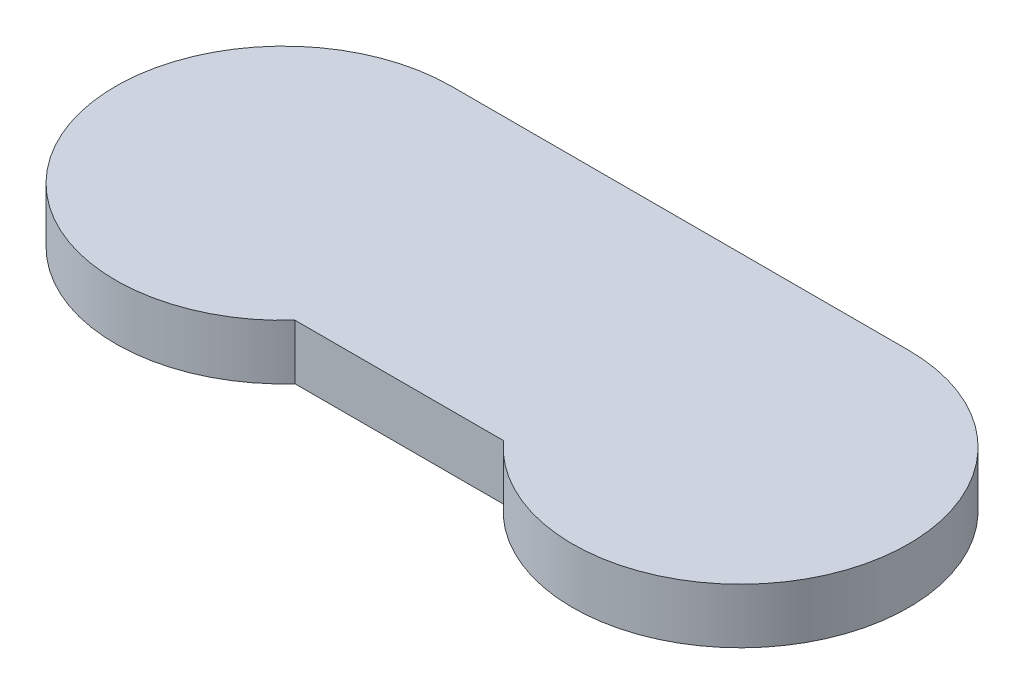
ISO-10303-21;
HEADER;
FILE_DESCRIPTION(('STEP AP214'),'2;1');
FILE_NAME('part.step','',(''),(''),'','','');
FILE_SCHEMA(('AUTOMOTIVE_DESIGN { 1 0 10303 214 1 1 1 1 }'));
ENDSEC;
DATA;
#1=APPLICATION_CONTEXT('core data for automotive mechanical design processes');
#2=APPLICATION_PROTOCOL_DEFINITION('international standard','automotive_design',2000,#1);
#3=PRODUCT_CONTEXT('',#1,'mechanical');
#4=PRODUCT('Part','Part','',(#3));
#5=PRODUCT_RELATED_PRODUCT_CATEGORY('part','',(#4));
#6=PRODUCT_DEFINITION_FORMATION('','',#4);
#7=PRODUCT_DEFINITION_CONTEXT('part definition',#1,'design');
#8=PRODUCT_DEFINITION('design','',#6,#7);
#9=PRODUCT_DEFINITION_SHAPE('','',#8);
#10=(LENGTH_UNIT() NAMED_UNIT(*) SI_UNIT(.MILLI.,.METRE.));
#11=(NAMED_UNIT(*) PLANE_ANGLE_UNIT() SI_UNIT($,.RADIAN.));
#12=(NAMED_UNIT(*) SI_UNIT($,.STERADIAN.) SOLID_ANGLE_UNIT());
#13=UNCERTAINTY_MEASURE_WITH_UNIT(LENGTH_MEASURE(1.E-05),#10,'distance_accuracy_value','');
#14=(GEOMETRIC_REPRESENTATION_CONTEXT(3) GLOBAL_UNCERTAINTY_ASSIGNED_CONTEXT((#13)) GLOBAL_UNIT_ASSIGNED_CONTEXT((#10,
#11,#12)) REPRESENTATION_CONTEXT('',''));
#15=CARTESIAN_POINT('',(0.,0.,0.));
#16=DIRECTION('',(0.,0.,1.));
#17=DIRECTION('',(1.,0.,0.));
#18=AXIS2_PLACEMENT_3D('',#15,#16,#17);
#19=CARTESIAN_POINT('',(-41.5000000000001,0.,0.));
#20=DIRECTION('',(0.,1.,0.));
#21=DIRECTION('',(0.,0.,1.));
#22=AXIS2_PLACEMENT_3D('',#19,#20,#21);
#23=PLANE('',#22);
#24=CARTESIAN_POINT('',(-41.5000000000001,0.,0.));
#25=DIRECTION('',(0.,1.,0.));
#26=DIRECTION('',(0.,0.,1.));
#27=AXIS2_PLACEMENT_3D('',#24,#25,#26);
#28=CIRCLE('',#27,30.5);
#29=CARTESIAN_POINT('',(-41.5000000000001,0.,-30.5));
#30=VERTEX_POINT('',#29);
#31=CARTESIAN_POINT('',(-18.9168204187277,0.,20.5));
#32=VERTEX_POINT('',#31);
#33=EDGE_CURVE('E126',#30,#32,#28,.T.);
#34=ORIENTED_EDGE('',*,*,#33,.F.);
#35=DIRECTION('',(-1.,0.,0.));
#36=VECTOR('',#35,1.);
#37=CARTESIAN_POINT('',(41.4999999999999,0.,-30.5));
#38=LINE('',#37,#36);
#39=CARTESIAN_POINT('',(41.4999999999999,0.,-30.5));
#40=VERTEX_POINT('',#39);
#41=EDGE_CURVE('E77',#40,#30,#38,.T.);
#42=ORIENTED_EDGE('',*,*,#41,.F.);
#43=CARTESIAN_POINT('',(41.4999999999999,0.,0.));
#44=DIRECTION('',(0.,1.,0.));
#45=DIRECTION('',(0.,0.,1.));
#46=AXIS2_PLACEMENT_3D('',#43,#44,#45);
#47=CIRCLE('',#46,30.5);
#48=CARTESIAN_POINT('',(18.9168204187274,0.,20.5));
#49=VERTEX_POINT('',#48);
#50=EDGE_CURVE('E144',#49,#40,#47,.T.);
#51=ORIENTED_EDGE('',*,*,#50,.F.);
#52=DIRECTION('',(1.,0.,0.));
#53=VECTOR('',#52,1.);
#54=CARTESIAN_POINT('',(-18.9168204187277,0.,20.5));
#55=LINE('',#54,#53);
#56=EDGE_CURVE('E130',#32,#49,#55,.T.);
#57=ORIENTED_EDGE('',*,*,#56,.F.);
#58=EDGE_LOOP('',(#34,#42,#51,#57));
#59=FACE_BOUND('',#58,.T.);
#60=CARTESIAN_POINT('',(41.4999999999999,0.,0.));
#61=DIRECTION('',(0.,1.,0.));
#62=DIRECTION('',(0.,0.,1.));
#63=AXIS2_PLACEMENT_3D('',#60,#61,#62);
#64=CIRCLE('',#63,25.5);
#65=CARTESIAN_POINT('',(21.2515432686833,0.,15.5));
#66=VERTEX_POINT('',#65);
#67=CARTESIAN_POINT('',(41.4999999999999,0.,-25.5));
#68=VERTEX_POINT('',#67);
#69=EDGE_CURVE('E47',#66,#68,#64,.T.);
#70=ORIENTED_EDGE('',*,*,#69,.T.);
#71=DIRECTION('',(-1.,0.,0.));
#72=VECTOR('',#71,1.);
#73=CARTESIAN_POINT('',(41.4999999999999,0.,-25.5));
#74=LINE('',#73,#72);
#75=CARTESIAN_POINT('',(-41.5000000000001,0.,-25.5));
#76=VERTEX_POINT('',#75);
#77=EDGE_CURVE('E125',#68,#76,#74,.T.);
#78=ORIENTED_EDGE('',*,*,#77,.T.);
#79=CARTESIAN_POINT('',(-41.5000000000001,0.,0.));
#80=DIRECTION('',(0.,1.,0.));
#81=DIRECTION('',(0.,0.,1.));
#82=AXIS2_PLACEMENT_3D('',#79,#80,#81);
#83=CIRCLE('',#82,25.5);
#84=CARTESIAN_POINT('',(-21.2515432686835,0.,15.5));
#85=VERTEX_POINT('',#84);
#86=EDGE_CURVE('E258',#76,#85,#83,.T.);
#87=ORIENTED_EDGE('',*,*,#86,.T.);
#88=DIRECTION('',(1.,0.,0.));
#89=VECTOR('',#88,1.);
#90=CARTESIAN_POINT('',(-21.2515432686835,0.,15.5));
#91=LINE('',#90,#89);
#92=EDGE_CURVE('E121',#85,#66,#91,.T.);
#93=ORIENTED_EDGE('',*,*,#92,.T.);
#94=EDGE_LOOP('',(#70,#78,#87,#93));
#95=FACE_BOUND('',#94,.T.);
#96=ADVANCED_FACE('F32',(#59,#95),#23,.F.);
#97=CARTESIAN_POINT('',(-41.5000000000001,10.,0.));
#98=DIRECTION('',(0.,-1.,0.));
#99=DIRECTION('',(0.,0.,-1.));
#100=AXIS2_PLACEMENT_3D('',#97,#98,#99);
#101=CYLINDRICAL_SURFACE('',#100,30.5);
#102=ORIENTED_EDGE('',*,*,#33,.T.);
#103=DIRECTION('',(0.,-1.,0.));
#104=VECTOR('',#103,1.);
#105=CARTESIAN_POINT('',(-18.9168204187277,10.,20.5));
#106=LINE('',#105,#104);
#107=CARTESIAN_POINT('',(-18.9168204187277,10.,20.5));
#108=VERTEX_POINT('',#107);
#109=EDGE_CURVE('E11',#108,#32,#106,.T.);
#110=ORIENTED_EDGE('',*,*,#109,.F.);
#111=CARTESIAN_POINT('',(-41.5000000000001,10.,0.));
#112=DIRECTION('',(0.,1.,0.));
#113=DIRECTION('',(0.,0.,1.));
#114=AXIS2_PLACEMENT_3D('',#111,#112,#113);
#115=CIRCLE('',#114,30.5);
#116=CARTESIAN_POINT('',(-41.5000000000001,10.,-30.5));
#117=VERTEX_POINT('',#116);
#118=EDGE_CURVE('E136',#117,#108,#115,.T.);
#119=ORIENTED_EDGE('',*,*,#118,.F.);
#120=DIRECTION('',(0.,-1.,0.));
#121=VECTOR('',#120,1.);
#122=CARTESIAN_POINT('',(-41.5000000000001,10.,-30.5));
#123=LINE('',#122,#121);
#124=EDGE_CURVE('E141',#117,#30,#123,.T.);
#125=ORIENTED_EDGE('',*,*,#124,.T.);
#126=EDGE_LOOP('',(#102,#110,#119,#125));
#127=FACE_BOUND('',#126,.T.);
#128=ADVANCED_FACE('F34',(#127),#101,.T.);
#129=CARTESIAN_POINT('',(-18.9168204187277,10.,20.5));
#130=DIRECTION('',(0.,0.,-1.));
#131=DIRECTION('',(-1.,0.,0.));
#132=AXIS2_PLACEMENT_3D('',#129,#130,#131);
#133=PLANE('',#132);
#134=ORIENTED_EDGE('',*,*,#56,.T.);
#135=DIRECTION('',(0.,-1.,0.));
#136=VECTOR('',#135,1.);
#137=CARTESIAN_POINT('',(18.9168204187274,10.,20.5));
#138=LINE('',#137,#136);
#139=CARTESIAN_POINT('',(18.9168204187274,10.,20.5));
#140=VERTEX_POINT('',#139);
#141=EDGE_CURVE('E40',#140,#49,#138,.T.);
#142=ORIENTED_EDGE('',*,*,#141,.F.);
#143=DIRECTION('',(1.,0.,0.));
#144=VECTOR('',#143,1.);
#145=CARTESIAN_POINT('',(-18.9168204187277,10.,20.5));
#146=LINE('',#145,#144);
#147=EDGE_CURVE('E84',#108,#140,#146,.T.);
#148=ORIENTED_EDGE('',*,*,#147,.F.);
#149=ORIENTED_EDGE('',*,*,#109,.T.);
#150=EDGE_LOOP('',(#134,#142,#148,#149));
#151=FACE_BOUND('',#150,.T.);
#152=ADVANCED_FACE('F170',(#151),#133,.F.);
#153=CARTESIAN_POINT('',(41.4999999999999,10.,0.));
#154=DIRECTION('',(0.,-1.,0.));
#155=DIRECTION('',(0.,0.,-1.));
#156=AXIS2_PLACEMENT_3D('',#153,#154,#155);
#157=CYLINDRICAL_SURFACE('',#156,30.5);
#158=ORIENTED_EDGE('',*,*,#50,.T.);
#159=DIRECTION('',(0.,-1.,0.));
#160=VECTOR('',#159,1.);
#161=CARTESIAN_POINT('',(41.4999999999999,10.,-30.5));
#162=LINE('',#161,#160);
#163=CARTESIAN_POINT('',(41.4999999999999,10.,-30.5));
#164=VERTEX_POINT('',#163);
#165=EDGE_CURVE('E148',#164,#40,#162,.T.);
#166=ORIENTED_EDGE('',*,*,#165,.F.);
#167=CARTESIAN_POINT('',(41.4999999999999,10.,0.));
#168=DIRECTION('',(0.,1.,0.));
#169=DIRECTION('',(0.,0.,1.));
#170=AXIS2_PLACEMENT_3D('',#167,#168,#169);
#171=CIRCLE('',#170,30.5);
#172=EDGE_CURVE('E139',#140,#164,#171,.T.);
#173=ORIENTED_EDGE('',*,*,#172,.F.);
#174=ORIENTED_EDGE('',*,*,#141,.T.);
#175=EDGE_LOOP('',(#158,#166,#173,#174));
#176=FACE_BOUND('',#175,.T.);
#177=ADVANCED_FACE('F153',(#176),#157,.T.);
#178=CARTESIAN_POINT('',(41.4999999999999,10.,-30.5));
#179=DIRECTION('',(0.,0.,1.));
#180=DIRECTION('',(1.,0.,0.));
#181=AXIS2_PLACEMENT_3D('',#178,#179,#180);
#182=PLANE('',#181);
#183=ORIENTED_EDGE('',*,*,#41,.T.);
#184=ORIENTED_EDGE('',*,*,#124,.F.);
#185=DIRECTION('',(-1.,0.,0.));
#186=VECTOR('',#185,1.);
#187=CARTESIAN_POINT('',(41.4999999999999,10.,-30.5));
#188=LINE('',#187,#186);
#189=EDGE_CURVE('E56',#164,#117,#188,.T.);
#190=ORIENTED_EDGE('',*,*,#189,.F.);
#191=ORIENTED_EDGE('',*,*,#165,.T.);
#192=EDGE_LOOP('',(#183,#184,#190,#191));
#193=FACE_BOUND('',#192,.T.);
#194=ADVANCED_FACE('F161',(#193),#182,.F.);
#195=CARTESIAN_POINT('',(-41.5000000000001,10.,0.));
#196=DIRECTION('',(0.,1.,0.));
#197=DIRECTION('',(0.,0.,1.));
#198=AXIS2_PLACEMENT_3D('',#195,#196,#197);
#199=PLANE('',#198);
#200=ORIENTED_EDGE('',*,*,#118,.T.);
#201=ORIENTED_EDGE('',*,*,#147,.T.);
#202=ORIENTED_EDGE('',*,*,#172,.T.);
#203=ORIENTED_EDGE('',*,*,#189,.T.);
#204=EDGE_LOOP('',(#200,#201,#202,#203));
#205=FACE_BOUND('',#204,.T.);
#206=ADVANCED_FACE('F163',(#205),#199,.T.);
#207=CARTESIAN_POINT('',(41.4999999999999,5.,0.));
#208=DIRECTION('',(0.,-1.,0.));
#209=DIRECTION('',(0.,0.,-1.));
#210=AXIS2_PLACEMENT_3D('',#207,#208,#209);
#211=CYLINDRICAL_SURFACE('',#210,25.5);
#212=ORIENTED_EDGE('',*,*,#69,.F.);
#213=DIRECTION('',(0.,-1.,0.));
#214=VECTOR('',#213,1.);
#215=CARTESIAN_POINT('',(21.2515432686833,5.,15.5));
#216=LINE('',#215,#214);
#217=CARTESIAN_POINT('',(21.2515432686833,5.,15.5));
#218=VERTEX_POINT('',#217);
#219=EDGE_CURVE('E120',#218,#66,#216,.T.);
#220=ORIENTED_EDGE('',*,*,#219,.F.);
#221=CARTESIAN_POINT('',(41.4999999999999,5.,0.));
#222=DIRECTION('',(0.,1.,0.));
#223=DIRECTION('',(0.,0.,1.));
#224=AXIS2_PLACEMENT_3D('',#221,#222,#223);
#225=CIRCLE('',#224,25.5);
#226=CARTESIAN_POINT('',(41.4999999999999,5.,-25.5));
#227=VERTEX_POINT('',#226);
#228=EDGE_CURVE('E112',#218,#227,#225,.T.);
#229=ORIENTED_EDGE('',*,*,#228,.T.);
#230=DIRECTION('',(0.,-1.,0.));
#231=VECTOR('',#230,1.);
#232=CARTESIAN_POINT('',(41.4999999999999,5.,-25.5));
#233=LINE('',#232,#231);
#234=EDGE_CURVE('E119',#227,#68,#233,.T.);
#235=ORIENTED_EDGE('',*,*,#234,.T.);
#236=EDGE_LOOP('',(#212,#220,#229,#235));
#237=FACE_BOUND('',#236,.T.);
#238=ADVANCED_FACE('F118',(#237),#211,.F.);
#239=CARTESIAN_POINT('',(41.4999999999999,5.,-25.5));
#240=DIRECTION('',(0.,0.,1.));
#241=DIRECTION('',(1.,0.,0.));
#242=AXIS2_PLACEMENT_3D('',#239,#240,#241);
#243=PLANE('',#242);
#244=ORIENTED_EDGE('',*,*,#77,.F.);
#245=ORIENTED_EDGE('',*,*,#234,.F.);
#246=DIRECTION('',(-1.,0.,0.));
#247=VECTOR('',#246,1.);
#248=CARTESIAN_POINT('',(41.4999999999999,5.,-25.5));
#249=LINE('',#248,#247);
#250=CARTESIAN_POINT('',(-41.5000000000001,5.,-25.5));
#251=VERTEX_POINT('',#250);
#252=EDGE_CURVE('E108',#227,#251,#249,.T.);
#253=ORIENTED_EDGE('',*,*,#252,.T.);
#254=DIRECTION('',(0.,-1.,0.));
#255=VECTOR('',#254,1.);
#256=CARTESIAN_POINT('',(-41.5000000000001,5.,-25.5));
#257=LINE('',#256,#255);
#258=EDGE_CURVE('E127',#251,#76,#257,.T.);
#259=ORIENTED_EDGE('',*,*,#258,.T.);
#260=EDGE_LOOP('',(#244,#245,#253,#259));
#261=FACE_BOUND('',#260,.T.);
#262=ADVANCED_FACE('F123',(#261),#243,.T.);
#263=CARTESIAN_POINT('',(-41.5000000000001,5.,0.));
#264=DIRECTION('',(0.,-1.,0.));
#265=DIRECTION('',(0.,0.,-1.));
#266=AXIS2_PLACEMENT_3D('',#263,#264,#265);
#267=CYLINDRICAL_SURFACE('',#266,25.5);
#268=ORIENTED_EDGE('',*,*,#86,.F.);
#269=ORIENTED_EDGE('',*,*,#258,.F.);
#270=CARTESIAN_POINT('',(-41.5000000000001,5.,0.));
#271=DIRECTION('',(0.,1.,0.));
#272=DIRECTION('',(0.,0.,1.));
#273=AXIS2_PLACEMENT_3D('',#270,#271,#272);
#274=CIRCLE('',#273,25.5);
#275=CARTESIAN_POINT('',(-21.2515432686835,5.,15.5));
#276=VERTEX_POINT('',#275);
#277=EDGE_CURVE('E113',#251,#276,#274,.T.);
#278=ORIENTED_EDGE('',*,*,#277,.T.);
#279=DIRECTION('',(0.,-1.,0.));
#280=VECTOR('',#279,1.);
#281=CARTESIAN_POINT('',(-21.2515432686835,5.,15.5));
#282=LINE('',#281,#280);
#283=EDGE_CURVE('E132',#276,#85,#282,.T.);
#284=ORIENTED_EDGE('',*,*,#283,.T.);
#285=EDGE_LOOP('',(#268,#269,#278,#284));
#286=FACE_BOUND('',#285,.T.);
#287=ADVANCED_FACE('F182',(#286),#267,.F.);
#288=CARTESIAN_POINT('',(-21.2515432686835,5.,15.5));
#289=DIRECTION('',(0.,0.,-1.));
#290=DIRECTION('',(-1.,0.,0.));
#291=AXIS2_PLACEMENT_3D('',#288,#289,#290);
#292=PLANE('',#291);
#293=ORIENTED_EDGE('',*,*,#92,.F.);
#294=ORIENTED_EDGE('',*,*,#283,.F.);
#295=DIRECTION('',(1.,0.,0.));
#296=VECTOR('',#295,1.);
#297=CARTESIAN_POINT('',(-21.2515432686835,5.,15.5));
#298=LINE('',#297,#296);
#299=EDGE_CURVE('E265',#276,#218,#298,.T.);
#300=ORIENTED_EDGE('',*,*,#299,.T.);
#301=ORIENTED_EDGE('',*,*,#219,.T.);
#302=EDGE_LOOP('',(#293,#294,#300,#301));
#303=FACE_BOUND('',#302,.T.);
#304=ADVANCED_FACE('F185',(#303),#292,.T.);
#305=CARTESIAN_POINT('',(41.4999999999999,5.,0.));
#306=DIRECTION('',(0.,1.,0.));
#307=DIRECTION('',(0.,0.,1.));
#308=AXIS2_PLACEMENT_3D('',#305,#306,#307);
#309=PLANE('',#308);
#310=ORIENTED_EDGE('',*,*,#228,.F.);
#311=ORIENTED_EDGE('',*,*,#299,.F.);
#312=ORIENTED_EDGE('',*,*,#277,.F.);
#313=ORIENTED_EDGE('',*,*,#252,.F.);
#314=EDGE_LOOP('',(#310,#311,#312,#313));
#315=FACE_BOUND('',#314,.T.);
#316=ADVANCED_FACE('F110',(#315),#309,.F.);
#317=CLOSED_SHELL('',(#96,#128,#152,#177,#194,#206,#238,#262,#287,#304,#316));
#318=MANIFOLD_SOLID_BREP('B2',#317);
#319=ADVANCED_BREP_SHAPE_REPRESENTATION('',(#18,#318),#14);
#320=SHAPE_DEFINITION_REPRESENTATION(#9,#319);
ENDSEC;
END-ISO-10303-21;
